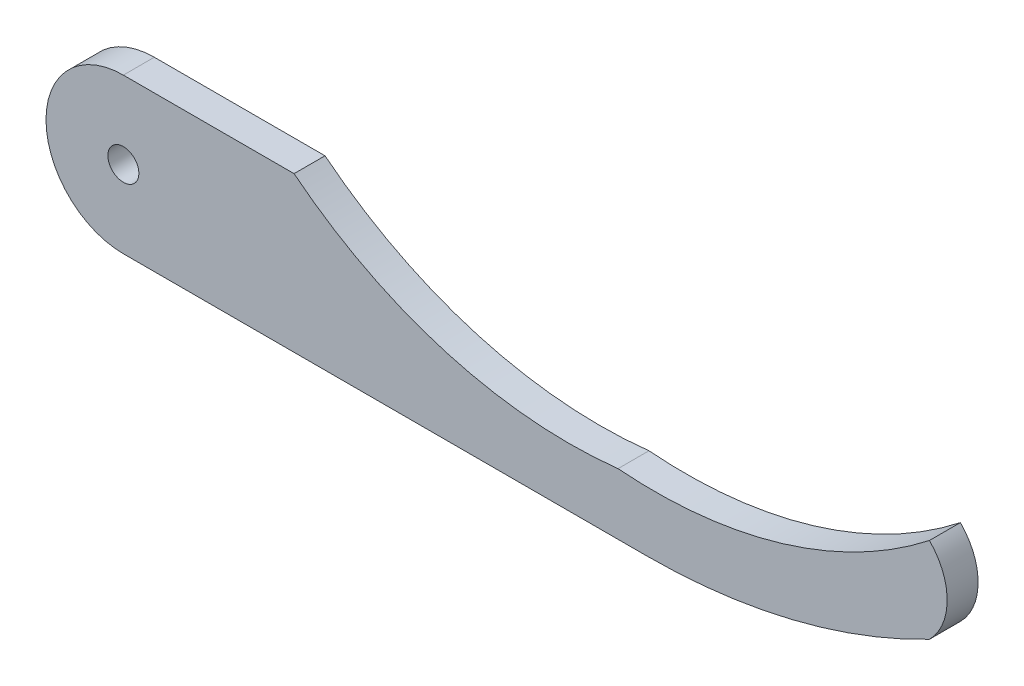
ISO-10303-21;
HEADER;
FILE_DESCRIPTION(('STEP AP214'),'2;1');
FILE_NAME('part.step','',(''),(''),'','','');
FILE_SCHEMA(('AUTOMOTIVE_DESIGN { 1 0 10303 214 1 1 1 1 }'));
ENDSEC;
DATA;
#1=APPLICATION_CONTEXT('core data for automotive mechanical design processes');
#2=APPLICATION_PROTOCOL_DEFINITION('international standard','automotive_design',2000,#1);
#3=PRODUCT_CONTEXT('',#1,'mechanical');
#4=PRODUCT('Part','Part','',(#3));
#5=PRODUCT_RELATED_PRODUCT_CATEGORY('part','',(#4));
#6=PRODUCT_DEFINITION_FORMATION('','',#4);
#7=PRODUCT_DEFINITION_CONTEXT('part definition',#1,'design');
#8=PRODUCT_DEFINITION('design','',#6,#7);
#9=PRODUCT_DEFINITION_SHAPE('','',#8);
#10=(LENGTH_UNIT() NAMED_UNIT(*) SI_UNIT(.MILLI.,.METRE.));
#11=(NAMED_UNIT(*) PLANE_ANGLE_UNIT() SI_UNIT($,.RADIAN.));
#12=(NAMED_UNIT(*) SI_UNIT($,.STERADIAN.) SOLID_ANGLE_UNIT());
#13=UNCERTAINTY_MEASURE_WITH_UNIT(LENGTH_MEASURE(1.E-05),#10,'distance_accuracy_value','');
#14=(GEOMETRIC_REPRESENTATION_CONTEXT(3) GLOBAL_UNCERTAINTY_ASSIGNED_CONTEXT((#13)) GLOBAL_UNIT_ASSIGNED_CONTEXT((#10,
#11,#12)) REPRESENTATION_CONTEXT('',''));
#15=CARTESIAN_POINT('',(0.,0.,0.));
#16=DIRECTION('',(0.,0.,1.));
#17=DIRECTION('',(1.,0.,0.));
#18=AXIS2_PLACEMENT_3D('',#15,#16,#17);
#19=CARTESIAN_POINT('',(-6.78679590382968,40.9674927823655,3.));
#20=DIRECTION('',(0.,0.,-1.));
#21=DIRECTION('',(-1.,0.,0.));
#22=AXIS2_PLACEMENT_3D('',#19,#20,#21);
#23=CYLINDRICAL_SURFACE('',#22,42.7922474488168);
#24=CARTESIAN_POINT('',(-6.78679590382968,40.9674927823655,0.));
#25=DIRECTION('',(0.,0.,-1.));
#26=DIRECTION('',(1.,0.,0.));
#27=AXIS2_PLACEMENT_3D('',#24,#25,#26);
#28=CIRCLE('',#27,42.7922474488168);
#29=CARTESIAN_POINT('',(-2.04824946547432,-1.56158690873908,0.));
#30=VERTEX_POINT('',#29);
#31=CARTESIAN_POINT('',(-33.4533173977007,7.5,0.));
#32=VERTEX_POINT('',#31);
#33=EDGE_CURVE('E127',#30,#32,#28,.T.);
#34=ORIENTED_EDGE('',*,*,#33,.T.);
#35=DIRECTION('',(0.,0.,-1.));
#36=VECTOR('',#35,1.);
#37=CARTESIAN_POINT('',(-33.4533173977007,7.5,3.));
#38=LINE('',#37,#36);
#39=CARTESIAN_POINT('',(-33.4533173977007,7.5,3.));
#40=VERTEX_POINT('',#39);
#41=EDGE_CURVE('E11',#40,#32,#38,.T.);
#42=ORIENTED_EDGE('',*,*,#41,.F.);
#43=CARTESIAN_POINT('',(-6.78679590382968,40.9674927823655,3.));
#44=DIRECTION('',(0.,0.,-1.));
#45=DIRECTION('',(1.,0.,0.));
#46=AXIS2_PLACEMENT_3D('',#43,#44,#45);
#47=CIRCLE('',#46,42.7922474488168);
#48=CARTESIAN_POINT('',(-2.04824946547432,-1.56158690873908,3.));
#49=VERTEX_POINT('',#48);
#50=EDGE_CURVE('E139',#49,#40,#47,.T.);
#51=ORIENTED_EDGE('',*,*,#50,.F.);
#52=DIRECTION('',(0.,0.,-1.));
#53=VECTOR('',#52,1.);
#54=CARTESIAN_POINT('',(-2.04824946547432,-1.56158690873908,3.));
#55=LINE('',#54,#53);
#56=EDGE_CURVE('E123',#49,#30,#55,.T.);
#57=ORIENTED_EDGE('',*,*,#56,.T.);
#58=EDGE_LOOP('',(#34,#42,#51,#57));
#59=FACE_BOUND('',#58,.T.);
#60=ADVANCED_FACE('F36',(#59),#23,.F.);
#61=CARTESIAN_POINT('',(-50.,7.5,3.));
#62=DIRECTION('',(0.,-1.,0.));
#63=DIRECTION('',(0.,0.,-1.));
#64=AXIS2_PLACEMENT_3D('',#61,#62,#63);
#65=PLANE('',#64);
#66=DIRECTION('',(-1.,0.,0.));
#67=VECTOR('',#66,1.);
#68=CARTESIAN_POINT('',(-50.,7.5,0.));
#69=LINE('',#68,#67);
#70=CARTESIAN_POINT('',(-50.,7.5,0.));
#71=VERTEX_POINT('',#70);
#72=EDGE_CURVE('E130',#32,#71,#69,.T.);
#73=ORIENTED_EDGE('',*,*,#72,.T.);
#74=DIRECTION('',(0.,0.,-1.));
#75=VECTOR('',#74,1.);
#76=CARTESIAN_POINT('',(-50.,7.5,3.));
#77=LINE('',#76,#75);
#78=CARTESIAN_POINT('',(-50.,7.5,3.));
#79=VERTEX_POINT('',#78);
#80=EDGE_CURVE('E45',#79,#71,#77,.T.);
#81=ORIENTED_EDGE('',*,*,#80,.F.);
#82=DIRECTION('',(-1.,0.,0.));
#83=VECTOR('',#82,1.);
#84=CARTESIAN_POINT('',(-50.,7.5,3.));
#85=LINE('',#84,#83);
#86=EDGE_CURVE('E93',#40,#79,#85,.T.);
#87=ORIENTED_EDGE('',*,*,#86,.F.);
#88=ORIENTED_EDGE('',*,*,#41,.T.);
#89=EDGE_LOOP('',(#73,#81,#87,#88));
#90=FACE_BOUND('',#89,.T.);
#91=ADVANCED_FACE('F180',(#90),#65,.F.);
#92=CARTESIAN_POINT('',(-50.,0.,3.));
#93=DIRECTION('',(0.,0.,-1.));
#94=DIRECTION('',(-1.,0.,0.));
#95=AXIS2_PLACEMENT_3D('',#92,#93,#94);
#96=CYLINDRICAL_SURFACE('',#95,7.5);
#97=CARTESIAN_POINT('',(-50.,0.,0.));
#98=DIRECTION('',(0.,0.,1.));
#99=DIRECTION('',(1.,0.,0.));
#100=AXIS2_PLACEMENT_3D('',#97,#98,#99);
#101=CIRCLE('',#100,7.5);
#102=CARTESIAN_POINT('',(-50.,-7.5,0.));
#103=VERTEX_POINT('',#102);
#104=EDGE_CURVE('E132',#71,#103,#101,.T.);
#105=ORIENTED_EDGE('',*,*,#104,.T.);
#106=DIRECTION('',(0.,0.,-1.));
#107=VECTOR('',#106,1.);
#108=CARTESIAN_POINT('',(-50.,-7.5,3.));
#109=LINE('',#108,#107);
#110=CARTESIAN_POINT('',(-50.,-7.5,3.));
#111=VERTEX_POINT('',#110);
#112=EDGE_CURVE('E143',#111,#103,#109,.T.);
#113=ORIENTED_EDGE('',*,*,#112,.F.);
#114=CARTESIAN_POINT('',(-50.,0.,3.));
#115=DIRECTION('',(0.,0.,1.));
#116=DIRECTION('',(1.,0.,0.));
#117=AXIS2_PLACEMENT_3D('',#114,#115,#116);
#118=CIRCLE('',#117,7.5);
#119=EDGE_CURVE('E152',#79,#111,#118,.T.);
#120=ORIENTED_EDGE('',*,*,#119,.F.);
#121=ORIENTED_EDGE('',*,*,#80,.T.);
#122=EDGE_LOOP('',(#105,#113,#120,#121));
#123=FACE_BOUND('',#122,.T.);
#124=ADVANCED_FACE('F150',(#123),#96,.T.);
#125=CARTESIAN_POINT('',(-50.,-7.5,3.));
#126=DIRECTION('',(0.,1.,0.));
#127=DIRECTION('',(-1.,0.,0.));
#128=AXIS2_PLACEMENT_3D('',#125,#126,#127);
#129=PLANE('',#128);
#130=DIRECTION('',(1.,0.,0.));
#131=VECTOR('',#130,1.);
#132=CARTESIAN_POINT('',(-50.,-7.5,0.));
#133=LINE('',#132,#131);
#134=CARTESIAN_POINT('',(0.707679736260796,-7.50000000000001,0.));
#135=VERTEX_POINT('',#134);
#136=EDGE_CURVE('E134',#103,#135,#133,.T.);
#137=ORIENTED_EDGE('',*,*,#136,.T.);
#138=DIRECTION('',(0.,0.,-1.));
#139=VECTOR('',#138,1.);
#140=CARTESIAN_POINT('',(0.707679736260796,-7.50000000000001,3.));
#141=LINE('',#140,#139);
#142=CARTESIAN_POINT('',(0.707679736260796,-7.50000000000001,3.));
#143=VERTEX_POINT('',#142);
#144=EDGE_CURVE('E118',#143,#135,#141,.T.);
#145=ORIENTED_EDGE('',*,*,#144,.F.);
#146=DIRECTION('',(1.,0.,0.));
#147=VECTOR('',#146,1.);
#148=CARTESIAN_POINT('',(-50.,-7.5,3.));
#149=LINE('',#148,#147);
#150=EDGE_CURVE('E109',#111,#143,#149,.T.);
#151=ORIENTED_EDGE('',*,*,#150,.F.);
#152=ORIENTED_EDGE('',*,*,#112,.T.);
#153=EDGE_LOOP('',(#137,#145,#151,#152));
#154=FACE_BOUND('',#153,.T.);
#155=ADVANCED_FACE('F158',(#154),#129,.F.);
#156=CARTESIAN_POINT('',(0.707679736260822,51.9731254827823,3.));
#157=DIRECTION('',(0.,0.,-1.));
#158=DIRECTION('',(-1.,0.,0.));
#159=AXIS2_PLACEMENT_3D('',#156,#157,#158);
#160=CYLINDRICAL_SURFACE('',#159,59.4731254827823);
#161=CARTESIAN_POINT('',(0.707679736260822,51.9731254827823,0.));
#162=DIRECTION('',(0.,0.,1.));
#163=DIRECTION('',(1.,0.,0.));
#164=AXIS2_PLACEMENT_3D('',#161,#162,#163);
#165=CIRCLE('',#164,59.4731254827823);
#166=CARTESIAN_POINT('',(28.138290623204,-0.79631871610885,0.));
#167=VERTEX_POINT('',#166);
#168=EDGE_CURVE('E117',#135,#167,#165,.T.);
#169=ORIENTED_EDGE('',*,*,#168,.T.);
#170=DIRECTION('',(0.,0.,-1.));
#171=VECTOR('',#170,1.);
#172=CARTESIAN_POINT('',(28.138290623204,-0.79631871610885,3.));
#173=LINE('',#172,#171);
#174=CARTESIAN_POINT('',(28.138290623204,-0.79631871610885,3.));
#175=VERTEX_POINT('',#174);
#176=EDGE_CURVE('E114',#175,#167,#173,.T.);
#177=ORIENTED_EDGE('',*,*,#176,.F.);
#178=CARTESIAN_POINT('',(0.707679736260822,51.9731254827823,3.));
#179=DIRECTION('',(0.,0.,1.));
#180=DIRECTION('',(1.,0.,0.));
#181=AXIS2_PLACEMENT_3D('',#178,#179,#180);
#182=CIRCLE('',#181,59.4731254827823);
#183=EDGE_CURVE('E103',#143,#175,#182,.T.);
#184=ORIENTED_EDGE('',*,*,#183,.F.);
#185=ORIENTED_EDGE('',*,*,#144,.T.);
#186=EDGE_LOOP('',(#169,#177,#184,#185));
#187=FACE_BOUND('',#186,.T.);
#188=ADVANCED_FACE('F115',(#187),#160,.T.);
#189=CARTESIAN_POINT('',(23.9901312651495,3.35184064194557,3.));
#190=DIRECTION('',(0.,0.,-1.));
#191=DIRECTION('',(-1.,0.,0.));
#192=AXIS2_PLACEMENT_3D('',#189,#190,#191);
#193=CYLINDRICAL_SURFACE('',#192,5.86638322304544);
#194=CARTESIAN_POINT('',(23.9901312651495,3.35184064194557,0.));
#195=DIRECTION('',(0.,0.,1.));
#196=DIRECTION('',(1.,0.,0.));
#197=AXIS2_PLACEMENT_3D('',#194,#195,#196);
#198=CIRCLE('',#197,5.86638322304544);
#199=CARTESIAN_POINT('',(28.1382906232039,7.5,0.));
#200=VERTEX_POINT('',#199);
#201=EDGE_CURVE('E79',#167,#200,#198,.T.);
#202=ORIENTED_EDGE('',*,*,#201,.T.);
#203=DIRECTION('',(0.,0.,-1.));
#204=VECTOR('',#203,1.);
#205=CARTESIAN_POINT('',(28.1382906232039,7.5,3.));
#206=LINE('',#205,#204);
#207=CARTESIAN_POINT('',(28.1382906232039,7.5,3.));
#208=VERTEX_POINT('',#207);
#209=EDGE_CURVE('E119',#208,#200,#206,.T.);
#210=ORIENTED_EDGE('',*,*,#209,.F.);
#211=CARTESIAN_POINT('',(23.9901312651495,3.35184064194557,3.));
#212=DIRECTION('',(0.,0.,1.));
#213=DIRECTION('',(1.,0.,0.));
#214=AXIS2_PLACEMENT_3D('',#211,#212,#213);
#215=CIRCLE('',#214,5.86638322304544);
#216=EDGE_CURVE('E107',#175,#208,#215,.T.);
#217=ORIENTED_EDGE('',*,*,#216,.F.);
#218=ORIENTED_EDGE('',*,*,#176,.T.);
#219=EDGE_LOOP('',(#202,#210,#217,#218));
#220=FACE_BOUND('',#219,.T.);
#221=ADVANCED_FACE('F121',(#220),#193,.T.);
#222=CARTESIAN_POINT('',(1.48641142581562,41.4739874501083,3.));
#223=DIRECTION('',(0.,0.,-1.));
#224=DIRECTION('',(-1.,0.,0.));
#225=AXIS2_PLACEMENT_3D('',#222,#223,#224);
#226=CYLINDRICAL_SURFACE('',#225,43.1804873526492);
#227=CARTESIAN_POINT('',(1.48641142581562,41.4739874501083,0.));
#228=DIRECTION('',(0.,0.,-1.));
#229=DIRECTION('',(1.,0.,0.));
#230=AXIS2_PLACEMENT_3D('',#227,#228,#229);
#231=CIRCLE('',#230,43.1804873526492);
#232=EDGE_CURVE('E85',#200,#30,#231,.T.);
#233=ORIENTED_EDGE('',*,*,#232,.T.);
#234=ORIENTED_EDGE('',*,*,#56,.F.);
#235=CARTESIAN_POINT('',(1.48641142581562,41.4739874501083,3.));
#236=DIRECTION('',(0.,0.,-1.));
#237=DIRECTION('',(1.,0.,0.));
#238=AXIS2_PLACEMENT_3D('',#235,#236,#237);
#239=CIRCLE('',#238,43.1804873526492);
#240=EDGE_CURVE('E53',#208,#49,#239,.T.);
#241=ORIENTED_EDGE('',*,*,#240,.F.);
#242=ORIENTED_EDGE('',*,*,#209,.T.);
#243=EDGE_LOOP('',(#233,#234,#241,#242));
#244=FACE_BOUND('',#243,.T.);
#245=ADVANCED_FACE('F187',(#244),#226,.F.);
#246=CARTESIAN_POINT('',(-6.78679590382968,40.9674927823655,3.));
#247=DIRECTION('',(0.,0.,1.));
#248=DIRECTION('',(1.,0.,0.));
#249=AXIS2_PLACEMENT_3D('',#246,#247,#248);
#250=PLANE('',#249);
#251=CARTESIAN_POINT('',(-50.,0.,3.));
#252=DIRECTION('',(0.,0.,1.));
#253=DIRECTION('',(1.,0.,0.));
#254=AXIS2_PLACEMENT_3D('',#251,#252,#253);
#255=CIRCLE('',#254,1.5);
#256=CARTESIAN_POINT('',(-48.5,0.,3.));
#257=VERTEX_POINT('',#256);
#258=EDGE_CURVE('E163',#257,#257,#255,.T.);
#259=ORIENTED_EDGE('',*,*,#258,.F.);
#260=EDGE_LOOP('',(#259));
#261=FACE_BOUND('',#260,.T.);
#262=ORIENTED_EDGE('',*,*,#50,.T.);
#263=ORIENTED_EDGE('',*,*,#86,.T.);
#264=ORIENTED_EDGE('',*,*,#119,.T.);
#265=ORIENTED_EDGE('',*,*,#150,.T.);
#266=ORIENTED_EDGE('',*,*,#183,.T.);
#267=ORIENTED_EDGE('',*,*,#216,.T.);
#268=ORIENTED_EDGE('',*,*,#240,.T.);
#269=EDGE_LOOP('',(#262,#263,#264,#265,#266,#267,#268));
#270=FACE_BOUND('',#269,.T.);
#271=ADVANCED_FACE('F105',(#261,#270),#250,.T.);
#272=CARTESIAN_POINT('',(-6.78679590382968,40.9674927823655,0.));
#273=DIRECTION('',(0.,0.,1.));
#274=DIRECTION('',(1.,0.,0.));
#275=AXIS2_PLACEMENT_3D('',#272,#273,#274);
#276=PLANE('',#275);
#277=CARTESIAN_POINT('',(-50.,0.,0.));
#278=DIRECTION('',(0.,0.,1.));
#279=DIRECTION('',(1.,0.,0.));
#280=AXIS2_PLACEMENT_3D('',#277,#278,#279);
#281=CIRCLE('',#280,1.5);
#282=CARTESIAN_POINT('',(-48.5,0.,0.));
#283=VERTEX_POINT('',#282);
#284=EDGE_CURVE('E39',#283,#283,#281,.T.);
#285=ORIENTED_EDGE('',*,*,#284,.T.);
#286=EDGE_LOOP('',(#285));
#287=FACE_BOUND('',#286,.T.);
#288=ORIENTED_EDGE('',*,*,#33,.F.);
#289=ORIENTED_EDGE('',*,*,#232,.F.);
#290=ORIENTED_EDGE('',*,*,#201,.F.);
#291=ORIENTED_EDGE('',*,*,#168,.F.);
#292=ORIENTED_EDGE('',*,*,#136,.F.);
#293=ORIENTED_EDGE('',*,*,#104,.F.);
#294=ORIENTED_EDGE('',*,*,#72,.F.);
#295=EDGE_LOOP('',(#288,#289,#290,#291,#292,#293,#294));
#296=FACE_BOUND('',#295,.T.);
#297=ADVANCED_FACE('F156',(#287,#296),#276,.F.);
#298=CARTESIAN_POINT('',(-50.,0.,-9.50000000000001));
#299=DIRECTION('',(0.,0.,1.));
#300=DIRECTION('',(1.,0.,0.));
#301=AXIS2_PLACEMENT_3D('',#298,#299,#300);
#302=CYLINDRICAL_SURFACE('',#301,1.5);
#303=ORIENTED_EDGE('',*,*,#258,.T.);
#304=EDGE_LOOP('',(#303));
#305=FACE_BOUND('',#304,.T.);
#306=ORIENTED_EDGE('',*,*,#284,.F.);
#307=EDGE_LOOP('',(#306));
#308=FACE_BOUND('',#307,.T.);
#309=ADVANCED_FACE('F171',(#305,#308),#302,.F.);
#310=CLOSED_SHELL('',(#60,#91,#124,#155,#188,#221,#245,#271,#297,#309));
#311=MANIFOLD_SOLID_BREP('B2',#310);
#312=ADVANCED_BREP_SHAPE_REPRESENTATION('',(#18,#311),#14);
#313=SHAPE_DEFINITION_REPRESENTATION(#9,#312);
ENDSEC;
END-ISO-10303-21;
